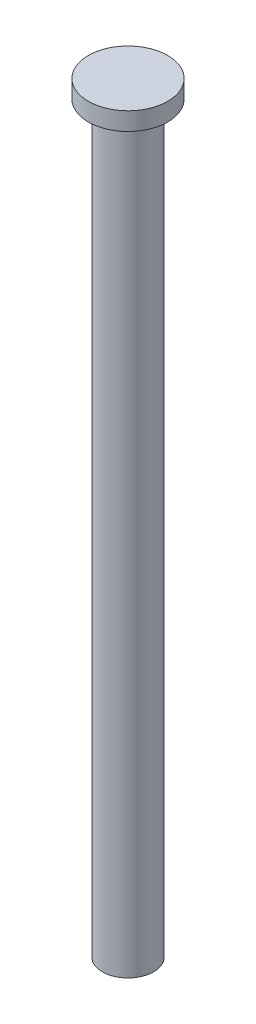
ISO-10303-21;
HEADER;
FILE_DESCRIPTION(('STEP AP214'),'2;1');
FILE_NAME('part.step','',(''),(''),'','','');
FILE_SCHEMA(('AUTOMOTIVE_DESIGN { 1 0 10303 214 1 1 1 1 }'));
ENDSEC;
DATA;
#1=APPLICATION_CONTEXT('core data for automotive mechanical design processes');
#2=APPLICATION_PROTOCOL_DEFINITION('international standard','automotive_design',2000,#1);
#3=PRODUCT_CONTEXT('',#1,'mechanical');
#4=PRODUCT('Part','Part','',(#3));
#5=PRODUCT_RELATED_PRODUCT_CATEGORY('part','',(#4));
#6=PRODUCT_DEFINITION_FORMATION('','',#4);
#7=PRODUCT_DEFINITION_CONTEXT('part definition',#1,'design');
#8=PRODUCT_DEFINITION('design','',#6,#7);
#9=PRODUCT_DEFINITION_SHAPE('','',#8);
#10=(LENGTH_UNIT() NAMED_UNIT(*) SI_UNIT(.MILLI.,.METRE.));
#11=(NAMED_UNIT(*) PLANE_ANGLE_UNIT() SI_UNIT($,.RADIAN.));
#12=(NAMED_UNIT(*) SI_UNIT($,.STERADIAN.) SOLID_ANGLE_UNIT());
#13=UNCERTAINTY_MEASURE_WITH_UNIT(LENGTH_MEASURE(1.E-05),#10,'distance_accuracy_value','');
#14=(GEOMETRIC_REPRESENTATION_CONTEXT(3) GLOBAL_UNCERTAINTY_ASSIGNED_CONTEXT((#13)) GLOBAL_UNIT_ASSIGNED_CONTEXT((#10,
#11,#12)) REPRESENTATION_CONTEXT('',''));
#15=CARTESIAN_POINT('',(0.,0.,0.));
#16=DIRECTION('',(0.,0.,1.));
#17=DIRECTION('',(1.,0.,0.));
#18=AXIS2_PLACEMENT_3D('',#15,#16,#17);
#19=CARTESIAN_POINT('',(0.,297.,0.));
#20=DIRECTION('',(0.,1.,0.));
#21=DIRECTION('',(0.,0.,1.));
#22=AXIS2_PLACEMENT_3D('',#19,#20,#21);
#23=PLANE('',#22);
#24=CARTESIAN_POINT('',(0.,297.,0.));
#25=DIRECTION('',(0.,-1.,0.));
#26=DIRECTION('',(0.,0.,-1.));
#27=AXIS2_PLACEMENT_3D('',#24,#25,#26);
#28=CIRCLE('',#27,15.5);
#29=CARTESIAN_POINT('',(0.,297.,-15.5));
#30=VERTEX_POINT('',#29);
#31=EDGE_CURVE('E10',#30,#30,#28,.T.);
#32=ORIENTED_EDGE('',*,*,#31,.F.);
#33=EDGE_LOOP('',(#32));
#34=FACE_BOUND('',#33,.T.);
#35=ADVANCED_FACE('F30',(#34),#23,.T.);
#36=CARTESIAN_POINT('',(0.,0.,0.));
#37=DIRECTION('',(0.,-1.,0.));
#38=DIRECTION('',(0.,0.,-1.));
#39=AXIS2_PLACEMENT_3D('',#36,#37,#38);
#40=CYLINDRICAL_SURFACE('',#39,15.5);
#41=ORIENTED_EDGE('',*,*,#31,.T.);
#42=EDGE_LOOP('',(#41));
#43=FACE_BOUND('',#42,.T.);
#44=CARTESIAN_POINT('',(0.,290.,0.));
#45=DIRECTION('',(0.,-1.,0.));
#46=DIRECTION('',(0.,0.,-1.));
#47=AXIS2_PLACEMENT_3D('',#44,#45,#46);
#48=CIRCLE('',#47,15.5);
#49=CARTESIAN_POINT('',(0.,290.,-15.5));
#50=VERTEX_POINT('',#49);
#51=EDGE_CURVE('E36',#50,#50,#48,.T.);
#52=ORIENTED_EDGE('',*,*,#51,.F.);
#53=EDGE_LOOP('',(#52));
#54=FACE_BOUND('',#53,.T.);
#55=ADVANCED_FACE('F72',(#43,#54),#40,.T.);
#56=CARTESIAN_POINT('',(15.5,290.,0.));
#57=DIRECTION('',(0.,-1.,0.));
#58=DIRECTION('',(0.,0.,-1.));
#59=AXIS2_PLACEMENT_3D('',#56,#57,#58);
#60=PLANE('',#59);
#61=ORIENTED_EDGE('',*,*,#51,.T.);
#62=EDGE_LOOP('',(#61));
#63=FACE_BOUND('',#62,.T.);
#64=CARTESIAN_POINT('',(0.,290.,0.));
#65=DIRECTION('',(0.,-1.,0.));
#66=DIRECTION('',(0.,0.,-1.));
#67=AXIS2_PLACEMENT_3D('',#64,#65,#66);
#68=CIRCLE('',#67,10.);
#69=CARTESIAN_POINT('',(0.,290.,-10.));
#70=VERTEX_POINT('',#69);
#71=EDGE_CURVE('E40',#70,#70,#68,.T.);
#72=ORIENTED_EDGE('',*,*,#71,.F.);
#73=EDGE_LOOP('',(#72));
#74=FACE_BOUND('',#73,.T.);
#75=ADVANCED_FACE('F77',(#63,#74),#60,.T.);
#76=CARTESIAN_POINT('',(0.,0.,0.));
#77=DIRECTION('',(0.,-1.,0.));
#78=DIRECTION('',(0.,0.,-1.));
#79=AXIS2_PLACEMENT_3D('',#76,#77,#78);
#80=CYLINDRICAL_SURFACE('',#79,10.);
#81=ORIENTED_EDGE('',*,*,#71,.T.);
#82=EDGE_LOOP('',(#81));
#83=FACE_BOUND('',#82,.T.);
#84=CARTESIAN_POINT('',(0.,0.,0.));
#85=DIRECTION('',(0.,-1.,0.));
#86=DIRECTION('',(0.,0.,-1.));
#87=AXIS2_PLACEMENT_3D('',#84,#85,#86);
#88=CIRCLE('',#87,10.);
#89=CARTESIAN_POINT('',(0.,0.,-10.));
#90=VERTEX_POINT('',#89);
#91=EDGE_CURVE('E44',#90,#90,#88,.T.);
#92=ORIENTED_EDGE('',*,*,#91,.F.);
#93=EDGE_LOOP('',(#92));
#94=FACE_BOUND('',#93,.T.);
#95=ADVANCED_FACE('F68',(#83,#94),#80,.T.);
#96=CARTESIAN_POINT('',(10.,0.,0.));
#97=DIRECTION('',(0.,-1.,0.));
#98=DIRECTION('',(0.,0.,-1.));
#99=AXIS2_PLACEMENT_3D('',#96,#97,#98);
#100=PLANE('',#99);
#101=ORIENTED_EDGE('',*,*,#91,.T.);
#102=EDGE_LOOP('',(#101));
#103=FACE_BOUND('',#102,.T.);
#104=CARTESIAN_POINT('',(0.,0.,0.));
#105=DIRECTION('',(0.,-1.,0.));
#106=DIRECTION('',(0.,0.,-1.));
#107=AXIS2_PLACEMENT_3D('',#104,#105,#106);
#108=CIRCLE('',#107,8.47000000000001);
#109=CARTESIAN_POINT('',(0.,0.,-8.47000000000001));
#110=VERTEX_POINT('',#109);
#111=EDGE_CURVE('E49',#110,#110,#108,.T.);
#112=ORIENTED_EDGE('',*,*,#111,.F.);
#113=EDGE_LOOP('',(#112));
#114=FACE_BOUND('',#113,.T.);
#115=ADVANCED_FACE('F60',(#103,#114),#100,.T.);
#116=CARTESIAN_POINT('',(0.,0.,0.));
#117=DIRECTION('',(0.,-1.,0.));
#118=DIRECTION('',(0.,0.,-1.));
#119=AXIS2_PLACEMENT_3D('',#116,#117,#118);
#120=CYLINDRICAL_SURFACE('',#119,8.47);
#121=ORIENTED_EDGE('',*,*,#111,.T.);
#122=EDGE_LOOP('',(#121));
#123=FACE_BOUND('',#122,.T.);
#124=CARTESIAN_POINT('',(0.,290.,0.));
#125=DIRECTION('',(0.,-1.,0.));
#126=DIRECTION('',(0.,0.,-1.));
#127=AXIS2_PLACEMENT_3D('',#124,#125,#126);
#128=CIRCLE('',#127,8.47);
#129=CARTESIAN_POINT('',(0.,290.,-8.47));
#130=VERTEX_POINT('',#129);
#131=EDGE_CURVE('E52',#130,#130,#128,.T.);
#132=ORIENTED_EDGE('',*,*,#131,.F.);
#133=EDGE_LOOP('',(#132));
#134=FACE_BOUND('',#133,.T.);
#135=ADVANCED_FACE('F58',(#123,#134),#120,.F.);
#136=CARTESIAN_POINT('',(8.47,290.,0.));
#137=DIRECTION('',(0.,-1.,0.));
#138=DIRECTION('',(0.,0.,-1.));
#139=AXIS2_PLACEMENT_3D('',#136,#137,#138);
#140=PLANE('',#139);
#141=ORIENTED_EDGE('',*,*,#131,.T.);
#142=EDGE_LOOP('',(#141));
#143=FACE_BOUND('',#142,.T.);
#144=ADVANCED_FACE('F56',(#143),#140,.T.);
#145=CLOSED_SHELL('',(#35,#55,#75,#95,#115,#135,#144));
#146=MANIFOLD_SOLID_BREP('B2',#145);
#147=ADVANCED_BREP_SHAPE_REPRESENTATION('',(#18,#146),#14);
#148=SHAPE_DEFINITION_REPRESENTATION(#9,#147);
ENDSEC;
END-ISO-10303-21;
